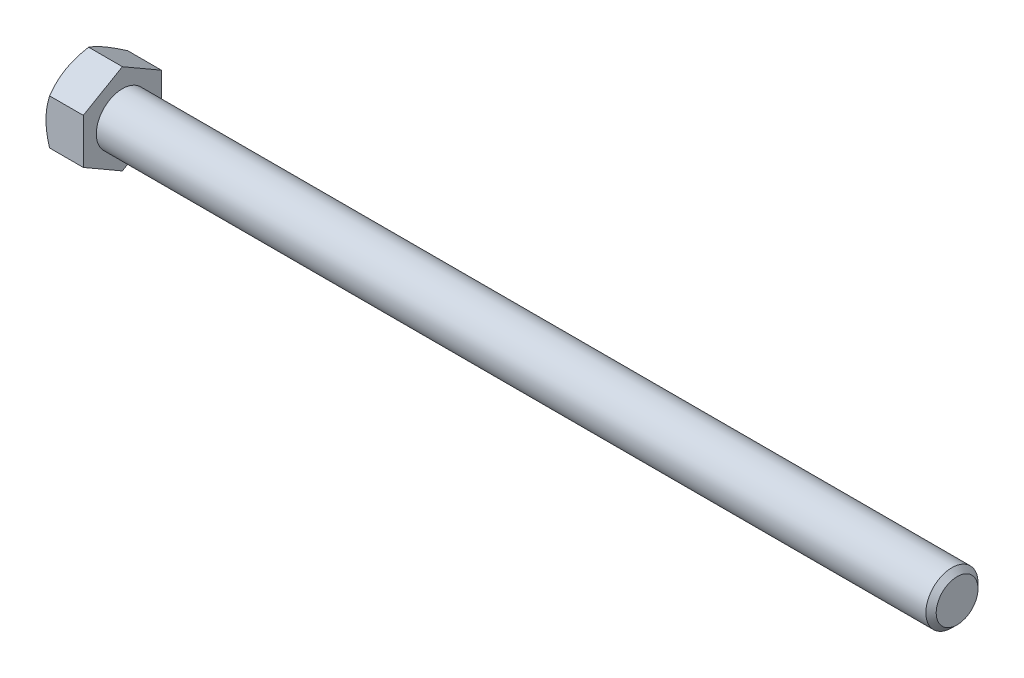
ISO-10303-21;
HEADER;
FILE_DESCRIPTION(('STEP AP214'),'2;1');
FILE_NAME('part.step','',(''),(''),'','','');
FILE_SCHEMA(('AUTOMOTIVE_DESIGN { 1 0 10303 214 1 1 1 1 }'));
ENDSEC;
DATA;
#1=APPLICATION_CONTEXT('core data for automotive mechanical design processes');
#2=APPLICATION_PROTOCOL_DEFINITION('international standard','automotive_design',2000,#1);
#3=PRODUCT_CONTEXT('',#1,'mechanical');
#4=PRODUCT('Part','Part','',(#3));
#5=PRODUCT_RELATED_PRODUCT_CATEGORY('part','',(#4));
#6=PRODUCT_DEFINITION_FORMATION('','',#4);
#7=PRODUCT_DEFINITION_CONTEXT('part definition',#1,'design');
#8=PRODUCT_DEFINITION('design','',#6,#7);
#9=PRODUCT_DEFINITION_SHAPE('','',#8);
#10=(LENGTH_UNIT() NAMED_UNIT(*) SI_UNIT(.MILLI.,.METRE.));
#11=(NAMED_UNIT(*) PLANE_ANGLE_UNIT() SI_UNIT($,.RADIAN.));
#12=(NAMED_UNIT(*) SI_UNIT($,.STERADIAN.) SOLID_ANGLE_UNIT());
#13=UNCERTAINTY_MEASURE_WITH_UNIT(LENGTH_MEASURE(1.E-05),#10,'distance_accuracy_value','');
#14=(GEOMETRIC_REPRESENTATION_CONTEXT(3) GLOBAL_UNCERTAINTY_ASSIGNED_CONTEXT((#13)) GLOBAL_UNIT_ASSIGNED_CONTEXT((#10,
#11,#12)) REPRESENTATION_CONTEXT('',''));
#15=CARTESIAN_POINT('',(0.,0.,0.));
#16=DIRECTION('',(0.,0.,1.));
#17=DIRECTION('',(1.,0.,0.));
#18=AXIS2_PLACEMENT_3D('',#15,#16,#17);
#19=CARTESIAN_POINT('',(6.8072,4.12077981131403,-7.1374));
#20=DIRECTION('',(0.,-0.866025403784438,0.500000000000001));
#21=DIRECTION('',(0.,-0.500000000000001,-0.866025403784438));
#22=AXIS2_PLACEMENT_3D('',#19,#20,#21);
#23=PLANE('',#22);
#24=CARTESIAN_POINT('',(0.637553523420349,8.24167509268191,0.000200000000000209));
#25=CARTESIAN_POINT('',(0.585265389565359,8.15109571898022,-0.15668807736911));
#26=CARTESIAN_POINT('',(0.535350289912887,8.06017862158373,-0.314161109336511));
#27=CARTESIAN_POINT('',(0.440919739394811,7.87760608276959,-0.630386022629449));
#28=CARTESIAN_POINT('',(0.396406617864104,7.78595034088604,-0.789138424377165));
#29=CARTESIAN_POINT('',(0.2718439466046,7.50951559742938,-1.26793744502137));
#30=CARTESIAN_POINT('',(0.200994122533562,7.32364541554993,-1.58987404364865));
#31=CARTESIAN_POINT('',(0.117914357261567,7.04549407114397,-2.07164630435335));
#32=CARTESIAN_POINT('',(0.0942473375753685,6.95404399131372,-2.23004248897558));
#33=CARTESIAN_POINT('',(0.0545611977075655,6.77073061920728,-2.54755056317072));
#34=CARTESIAN_POINT('',(0.0385414017966346,6.67886736416472,-2.70666238825308));
#35=CARTESIAN_POINT('',(0.0145579786669828,6.49498130931768,-3.02516237805154));
#36=CARTESIAN_POINT('',(0.00658520869042932,6.40295880983915,-3.18455002258784));
#37=CARTESIAN_POINT('',(-0.00114175893561454,6.21883388819856,-3.50346374180898));
#38=CARTESIAN_POINT('',(-0.000896210482460422,6.12673146859347,-3.66298981206503));
#39=CARTESIAN_POINT('',(0.0110730517201779,5.87440161908355,-4.10003793168242));
#40=CARTESIAN_POINT('',(0.0311658852990929,5.71425679021456,-4.37741691185292));
#41=CARTESIAN_POINT('',(0.0948800883359073,5.39503079963205,-4.93033254663834));
#42=CARTESIAN_POINT('',(0.138523234308961,5.23595076056063,-5.20586725678008));
#43=CARTESIAN_POINT('',(0.247618299095076,4.91608234409664,-5.75989560583231));
#44=CARTESIAN_POINT('',(0.313532435992711,4.75533432745402,-6.03831933787326));
#45=CARTESIAN_POINT('',(0.463130880450464,4.43623548204411,-6.59101475075978));
#46=CARTESIAN_POINT('',(0.546780048637373,4.27788056676996,-6.86529350964288));
#47=CARTESIAN_POINT('',(0.637553523420342,4.12066434126019,-7.1376));
#48=B_SPLINE_CURVE_WITH_KNOTS('',3,(#24,#25,#26,#27,#28,#29,#30,#31,#32,#33,#34,#35,#36,#37,#38,
#39,#40,#41,#42,#43,#44,#45,#46,#47),.UNSPECIFIED.,.F.,.F.,(4,2,2,2,2,2,2,2,2,2,2,4),(0.,
0.565616271543686,1.13147557690344,2.26554547664276,2.81869146049269,3.37178855781927,
3.9242565351942,4.47670744459711,5.43845614829341,6.40109569003608,7.3850851165131,
8.36714283329691),.UNSPECIFIED.);
#49=CARTESIAN_POINT('',(0.637486855352631,8.24155962262808,0.));
#50=VERTEX_POINT('',#49);
#51=CARTESIAN_POINT('',(0.,6.18116971697105,-3.56870000000001));
#52=VERTEX_POINT('',#51);
#53=EDGE_CURVE('E47',#50,#52,#48,.T.);
#54=ORIENTED_EDGE('',*,*,#53,.F.);
#55=DIRECTION('',(-1.,0.,0.));
#56=VECTOR('',#55,1.);
#57=CARTESIAN_POINT('',(6.8072,8.24155962262808,0.));
#58=LINE('',#57,#56);
#59=CARTESIAN_POINT('',(6.8072,8.24155962262808,0.));
#60=VERTEX_POINT('',#59);
#61=EDGE_CURVE('E143',#60,#50,#58,.T.);
#62=ORIENTED_EDGE('',*,*,#61,.F.);
#63=DIRECTION('',(0.,0.500000000000001,0.866025403784438));
#64=VECTOR('',#63,1.);
#65=CARTESIAN_POINT('',(6.8072,4.12077981131403,-7.1374));
#66=LINE('',#65,#64);
#67=CARTESIAN_POINT('',(6.8072,4.12077981131403,-7.1374));
#68=VERTEX_POINT('',#67);
#69=EDGE_CURVE('E228',#68,#60,#66,.T.);
#70=ORIENTED_EDGE('',*,*,#69,.F.);
#71=DIRECTION('',(-1.,0.,0.));
#72=VECTOR('',#71,1.);
#73=CARTESIAN_POINT('',(6.8072,4.12077981131403,-7.1374));
#74=LINE('',#73,#72);
#75=CARTESIAN_POINT('',(0.637486855352626,4.12077981131403,-7.1374));
#76=VERTEX_POINT('',#75);
#77=EDGE_CURVE('E131',#68,#76,#74,.T.);
#78=ORIENTED_EDGE('',*,*,#77,.T.);
#79=EDGE_CURVE('E125',#52,#76,#48,.T.);
#80=ORIENTED_EDGE('',*,*,#79,.F.);
#81=EDGE_LOOP('',(#54,#62,#70,#78,#80));
#82=FACE_BOUND('',#81,.T.);
#83=ADVANCED_FACE('F31',(#82),#23,.F.);
#84=CARTESIAN_POINT('',(6.8072,8.24155962262808,0.));
#85=DIRECTION('',(0.,-0.866025403784438,-0.500000000000001));
#86=DIRECTION('',(0.,0.500000000000001,-0.866025403784438));
#87=AXIS2_PLACEMENT_3D('',#84,#85,#86);
#88=PLANE('',#87);
#89=CARTESIAN_POINT('',(0.637553523420344,4.12066434126019,7.1376));
#90=CARTESIAN_POINT('',(0.585265389565354,4.21124371496189,6.98071192263089));
#91=CARTESIAN_POINT('',(0.535350289912882,4.30216081235838,6.82323889066349));
#92=CARTESIAN_POINT('',(0.440919739394807,4.48473335117252,6.50701397737055));
#93=CARTESIAN_POINT('',(0.3964066178641,4.57638909305606,6.34826157562283));
#94=CARTESIAN_POINT('',(0.271843946604597,4.85282383651273,5.86946255497863));
#95=CARTESIAN_POINT('',(0.20099412253356,5.03869401839218,5.54752595635135));
#96=CARTESIAN_POINT('',(0.117914357261566,5.31684536279814,5.06575369564665));
#97=CARTESIAN_POINT('',(0.094247337575367,5.40829544262839,4.90735751102442));
#98=CARTESIAN_POINT('',(0.0545611977075641,5.59160881473483,4.58984943682928));
#99=CARTESIAN_POINT('',(0.0385414017966333,5.68347206977738,4.43073761174692));
#100=CARTESIAN_POINT('',(0.0145579786669821,5.86735812462442,4.11223762194846));
#101=CARTESIAN_POINT('',(0.00658520869042904,5.95938062410295,3.95284997741216));
#102=CARTESIAN_POINT('',(-0.00114175893561427,6.14350554574354,3.63393625819102));
#103=CARTESIAN_POINT('',(-0.000896210482460006,6.23560796534864,3.47441018793497));
#104=CARTESIAN_POINT('',(0.0110730517201789,6.48793781485856,3.03736206831758));
#105=CARTESIAN_POINT('',(0.0311658852990944,6.64808264372754,2.75998308814708));
#106=CARTESIAN_POINT('',(0.0948800883359096,6.96730863431005,2.20706745336167));
#107=CARTESIAN_POINT('',(0.138523234308963,7.12638867338148,1.93153274321992));
#108=CARTESIAN_POINT('',(0.24761829909508,7.44625708984546,1.37750439416769));
#109=CARTESIAN_POINT('',(0.313532435992716,7.60700510648809,1.09908066212674));
#110=CARTESIAN_POINT('',(0.463130880450469,7.926103951898,0.546385249240216));
#111=CARTESIAN_POINT('',(0.546780048637379,8.08445886717215,0.272106490357122));
#112=CARTESIAN_POINT('',(0.637553523420349,8.24167509268191,-0.000199999999999955));
#113=B_SPLINE_CURVE_WITH_KNOTS('',3,(#89,#90,#91,#92,#93,#94,#95,#96,#97,#98,#99,#100,#101,#102,
#103,#104,#105,#106,#107,#108,#109,#110,#111,#112),.UNSPECIFIED.,.F.,.F.,(4,2,2,2,2,2,2,2,2,2,2,
4),(0.,0.565616271543686,1.13147557690344,2.26554547664276,2.81869146049269,3.37178855781927,
3.92425653519419,4.4767074445971,5.4384561482934,6.40109569003607,7.3850851165131,
8.36714283329691),.UNSPECIFIED.);
#114=CARTESIAN_POINT('',(0.637486855352626,4.12077981131403,7.1374));
#115=VERTEX_POINT('',#114);
#116=CARTESIAN_POINT('',(0.,6.18116971697105,3.56870000000001));
#117=VERTEX_POINT('',#116);
#118=EDGE_CURVE('E54',#115,#117,#113,.T.);
#119=ORIENTED_EDGE('',*,*,#118,.F.);
#120=DIRECTION('',(-1.,0.,0.));
#121=VECTOR('',#120,1.);
#122=CARTESIAN_POINT('',(6.8072,4.12077981131403,7.1374));
#123=LINE('',#122,#121);
#124=CARTESIAN_POINT('',(6.8072,4.12077981131403,7.1374));
#125=VERTEX_POINT('',#124);
#126=EDGE_CURVE('E141',#125,#115,#123,.T.);
#127=ORIENTED_EDGE('',*,*,#126,.F.);
#128=DIRECTION('',(0.,-0.500000000000001,0.866025403784438));
#129=VECTOR('',#128,1.);
#130=CARTESIAN_POINT('',(6.8072,8.24155962262808,0.));
#131=LINE('',#130,#129);
#132=EDGE_CURVE('E226',#60,#125,#131,.T.);
#133=ORIENTED_EDGE('',*,*,#132,.F.);
#134=ORIENTED_EDGE('',*,*,#61,.T.);
#135=EDGE_CURVE('E158',#117,#50,#113,.T.);
#136=ORIENTED_EDGE('',*,*,#135,.F.);
#137=EDGE_LOOP('',(#119,#127,#133,#134,#136));
#138=FACE_BOUND('',#137,.T.);
#139=ADVANCED_FACE('F164',(#138),#88,.F.);
#140=CARTESIAN_POINT('',(6.8072,4.12077981131403,7.1374));
#141=DIRECTION('',(0.,0.,-1.));
#142=DIRECTION('',(-1.,0.,0.));
#143=AXIS2_PLACEMENT_3D('',#140,#141,#142);
#144=PLANE('',#143);
#145=CARTESIAN_POINT('',(3.51793891464087,-11.1403587268437,7.1374));
#146=CARTESIAN_POINT('',(3.36611761361542,-10.8279722926893,7.1374));
#147=CARTESIAN_POINT('',(3.21573167435817,-10.5148763007017,7.1374));
#148=CARTESIAN_POINT('',(2.91863653133452,-9.88688803265219,7.1374));
#149=CARTESIAN_POINT('',(2.77192789362364,-9.57199548909054,7.1374));
#150=CARTESIAN_POINT('',(2.48227074397641,-8.93844907707202,7.1374));
#151=CARTESIAN_POINT('',(2.33934643030355,-8.6197841073444,7.1374));
#152=CARTESIAN_POINT('',(2.05925336317275,-7.97994405772779,7.1374));
#153=CARTESIAN_POINT('',(1.92208434228597,-7.65876909529408,7.1374));
#154=CARTESIAN_POINT('',(1.65065378230837,-7.00284865103084,7.1374));
#155=CARTESIAN_POINT('',(1.51663374065787,-6.66800268560584,7.1374));
#156=CARTESIAN_POINT('',(1.25856485288051,-5.99442084818064,7.1374));
#157=CARTESIAN_POINT('',(1.13451711533335,-5.6556845484785,7.1374));
#158=CARTESIAN_POINT('',(0.899596727677591,-4.97438980758155,7.1374));
#159=CARTESIAN_POINT('',(0.788698036742919,-4.63184044199148,7.1374));
#160=CARTESIAN_POINT('',(0.583585288609214,-3.94184101121261,7.1374));
#161=CARTESIAN_POINT('',(0.489366053461915,-3.5943925031972,7.1374));
#162=CARTESIAN_POINT('',(0.322585119775289,-2.89623643412328,7.1374));
#163=CARTESIAN_POINT('',(0.249906108267923,-2.54555766855628,7.1374));
#164=CARTESIAN_POINT('',(0.160162927876226,-2.01629019056174,7.1374));
#165=CARTESIAN_POINT('',(0.133459926561135,-1.83931395899738,7.1374));
#166=CARTESIAN_POINT('',(0.0870009608751857,-1.48445773938035,7.1374));
#167=CARTESIAN_POINT('',(0.0672443235865571,-1.3065778405635,7.1374));
#168=CARTESIAN_POINT('',(0.0353233928817902,-0.952509042934668,7.1374));
#169=CARTESIAN_POINT('',(0.0230620606560359,-0.776328928434239,7.1374));
#170=CARTESIAN_POINT('',(0.00600431660240757,-0.423607840789667,7.1374));
#171=CARTESIAN_POINT('',(0.00120777872271188,-0.247066873789351,7.1374));
#172=CARTESIAN_POINT('',(-0.000805707966080775,0.106061109313546,7.1374));
#173=CARTESIAN_POINT('',(0.00197740745485913,0.28264812579367,7.1374));
#174=CARTESIAN_POINT('',(0.0150543642253251,0.63554598012671,7.1374));
#175=CARTESIAN_POINT('',(0.0253485677088158,0.811856804252743,7.1374));
#176=CARTESIAN_POINT('',(0.0587173546676627,1.23335791869126,7.1374));
#177=CARTESIAN_POINT('',(0.0852317102922993,1.47828183508495,7.1374));
#178=CARTESIAN_POINT('',(0.151325348901079,1.96634766484074,7.1374));
#179=CARTESIAN_POINT('',(0.190906342916658,2.20948934056,7.1374));
#180=CARTESIAN_POINT('',(0.327153349211708,2.93593608611635,7.1374));
#181=CARTESIAN_POINT('',(0.441300495017734,3.41600789467397,7.1374));
#182=CARTESIAN_POINT('',(0.639740105584515,4.13409780337111,7.1374));
#183=CARTESIAN_POINT('',(0.711386839279741,4.37582477933243,7.1374));
#184=CARTESIAN_POINT('',(0.862240726867139,4.85693123459409,7.1374));
#185=CARTESIAN_POINT('',(0.941447936163008,5.0963106966775,7.1374));
#186=CARTESIAN_POINT('',(1.10614180608764,5.57279746249284,7.1374));
#187=CARTESIAN_POINT('',(1.19162653724197,5.80990543927401,7.1374));
#188=CARTESIAN_POINT('',(1.36785754588297,6.28214651090288,7.1374));
#189=CARTESIAN_POINT('',(1.45860372166631,6.51727964382366,7.1374));
#190=CARTESIAN_POINT('',(1.70099135878087,7.12822933634873,7.1374));
#191=CARTESIAN_POINT('',(1.85611245200932,7.50266378649049,7.1374));
#192=CARTESIAN_POINT('',(2.17492034788948,8.24788094227113,7.1374));
#193=CARTESIAN_POINT('',(2.33860795452501,8.61866330125999,7.1374));
#194=CARTESIAN_POINT('',(2.67260301704527,9.35737269718076,7.1374));
#195=CARTESIAN_POINT('',(2.84291264405931,9.72529874938111,7.1374));
#196=CARTESIAN_POINT('',(3.18863367809309,10.4587232704181,7.1374));
#197=CARTESIAN_POINT('',(3.36404491157502,10.8242218213112,7.1374));
#198=CARTESIAN_POINT('',(3.71915496627051,11.553777334436,7.1374));
#199=CARTESIAN_POINT('',(3.89885959822868,11.9178314626509,7.1374));
#200=CARTESIAN_POINT('',(4.26150568432079,12.6443245246618,7.1374));
#201=CARTESIAN_POINT('',(4.44444716083245,13.0067634472695,7.1374));
#202=CARTESIAN_POINT('',(4.81291716764718,13.7302353242129,7.1374));
#203=CARTESIAN_POINT('',(4.99844519827986,14.0912685333268,7.1374));
#204=CARTESIAN_POINT('',(5.37165471040539,14.8122208146436,7.1374));
#205=CARTESIAN_POINT('',(5.55933620037513,15.1721398824536,7.1374));
#206=CARTESIAN_POINT('',(6.08751400276292,16.1789579520409,7.1374));
#207=CARTESIAN_POINT('',(6.43000254365915,16.8248116492746,7.1374));
#208=CARTESIAN_POINT('',(7.11919785487999,18.1143032770824,7.1374));
#209=CARTESIAN_POINT('',(7.46590484738288,18.7579410886394,7.1374));
#210=CARTESIAN_POINT('',(8.16140637459832,20.0415314633598,7.1374));
#211=CARTESIAN_POINT('',(8.51019123426675,20.6814892741017,7.1374));
#212=CARTESIAN_POINT('',(9.21019417047445,21.9600146152104,7.1374));
#213=CARTESIAN_POINT('',(9.56141207357471,22.598582240497,7.1374));
#214=CARTESIAN_POINT('',(9.9135191344137,23.2366555668876,7.1374));
#215=B_SPLINE_CURVE_WITH_KNOTS('',3,(#145,#146,#147,#148,#149,#150,#151,#152,#153,#154,#155,
#156,#157,#158,#159,#160,#161,#162,#163,#164,#165,#166,#167,#168,#169,#170,#171,#172,#173,#174,
#175,#176,#177,#178,#179,#180,#181,#182,#183,#184,#185,#186,#187,#188,#189,#190,#191,#192,#193,
#194,#195,#196,#197,#198,#199,#200,#201,#202,#203,#204,#205,#206,#207,#208,#209,#210,#211,#212,
#213,#214),.UNSPECIFIED.,.F.,.F.,(4,2,2,2,2,2,2,2,2,2,2,2,2,2,2,2,2,2,2,2,2,2,2,2,2,2,2,2,2,2,2,
2,2,2,4),(0.,1.0419888362068,2.08413709519682,3.13183784368231,4.17948985504911,
5.26137797247102,6.34338619307611,7.42321444996099,8.50270689628367,9.57620733057732,
10.113030795566,10.6498022423129,11.179468394122,11.7091256017988,12.2387872978086,
12.7684745322176,13.5071235743819,14.245869378494,15.7241255438818,16.4804246089875,
17.2367292167316,17.9928023300467,18.7488608333938,19.9645892594812,21.1804319893616,
22.3966767697582,23.6128802262777,24.8308351286452,26.0487984545625,27.2665296678531,
28.4842656762731,30.6773737382256,32.8705978115956,35.0570894097064,37.2434267159856),.UNSPECIFIED.);
#216=CARTESIAN_POINT('',(0.637486855352625,-4.12077981131402,7.1374));
#217=VERTEX_POINT('',#216);
#218=CARTESIAN_POINT('',(0.,0.,7.1374));
#219=VERTEX_POINT('',#218);
#220=EDGE_CURVE('E238',#217,#219,#215,.T.);
#221=ORIENTED_EDGE('',*,*,#220,.F.);
#222=DIRECTION('',(-1.,0.,0.));
#223=VECTOR('',#222,1.);
#224=CARTESIAN_POINT('',(6.8072,-4.12077981131402,7.1374));
#225=LINE('',#224,#223);
#226=CARTESIAN_POINT('',(6.8072,-4.12077981131402,7.1374));
#227=VERTEX_POINT('',#226);
#228=EDGE_CURVE('E133',#227,#217,#225,.T.);
#229=ORIENTED_EDGE('',*,*,#228,.F.);
#230=DIRECTION('',(0.,-1.,0.));
#231=VECTOR('',#230,1.);
#232=CARTESIAN_POINT('',(6.8072,4.12077981131403,7.1374));
#233=LINE('',#232,#231);
#234=EDGE_CURVE('E222',#125,#227,#233,.T.);
#235=ORIENTED_EDGE('',*,*,#234,.F.);
#236=ORIENTED_EDGE('',*,*,#126,.T.);
#237=EDGE_CURVE('E180',#219,#115,#215,.T.);
#238=ORIENTED_EDGE('',*,*,#237,.F.);
#239=EDGE_LOOP('',(#221,#229,#235,#236,#238));
#240=FACE_BOUND('',#239,.T.);
#241=ADVANCED_FACE('F244',(#240),#144,.F.);
#242=CARTESIAN_POINT('',(6.8072,-8.24155962262808,0.));
#243=DIRECTION('',(0.,0.866025403784438,-0.500000000000002));
#244=DIRECTION('',(0.,0.500000000000002,0.866025403784438));
#245=AXIS2_PLACEMENT_3D('',#242,#243,#244);
#246=PLANE('',#245);
#247=CARTESIAN_POINT('',(0.637553523420351,-8.24167509268192,-0.000200000000000067));
#248=CARTESIAN_POINT('',(0.585265389565361,-8.15109571898022,0.15668807736911));
#249=CARTESIAN_POINT('',(0.535350289912889,-8.06017862158373,0.314161109336512));
#250=CARTESIAN_POINT('',(0.440919739394813,-7.87760608276959,0.63038602262945));
#251=CARTESIAN_POINT('',(0.396406617864105,-7.78595034088604,0.789138424377165));
#252=CARTESIAN_POINT('',(0.271843946604601,-7.50951559742938,1.26793744502137));
#253=CARTESIAN_POINT('',(0.200994122533563,-7.32364541554993,1.58987404364865));
#254=CARTESIAN_POINT('',(0.117914357261568,-7.04549407114397,2.07164630435335));
#255=CARTESIAN_POINT('',(0.0942473375753691,-6.95404399131372,2.23004248897558));
#256=CARTESIAN_POINT('',(0.0545611977075657,-6.77073061920728,2.54755056317072));
#257=CARTESIAN_POINT('',(0.0385414017966347,-6.67886736416472,2.70666238825308));
#258=CARTESIAN_POINT('',(0.0145579786669826,-6.49498130931768,3.02516237805154));
#259=CARTESIAN_POINT('',(0.00658520869042883,-6.40295880983915,3.18455002258784));
#260=CARTESIAN_POINT('',(-0.0011417589356153,-6.21883388819856,3.50346374180898));
#261=CARTESIAN_POINT('',(-0.000896210482461203,-6.12673146859347,3.66298981206503));
#262=CARTESIAN_POINT('',(0.0110730517201772,-5.87440161908354,4.10003793168242));
#263=CARTESIAN_POINT('',(0.0311658852990923,-5.71425679021456,4.37741691185292));
#264=CARTESIAN_POINT('',(0.0948800883359067,-5.39503079963205,4.93033254663834));
#265=CARTESIAN_POINT('',(0.13852323430896,-5.23595076056062,5.20586725678008));
#266=CARTESIAN_POINT('',(0.247618299095075,-4.91608234409664,5.75989560583231));
#267=CARTESIAN_POINT('',(0.31353243599271,-4.75533432745402,6.03831933787326));
#268=CARTESIAN_POINT('',(0.463130880450462,-4.4362354820441,6.59101475075978));
#269=CARTESIAN_POINT('',(0.546780048637372,-4.27788056676995,6.86529350964288));
#270=CARTESIAN_POINT('',(0.637553523420342,-4.12066434126019,7.1376));
#271=B_SPLINE_CURVE_WITH_KNOTS('',3,(#247,#248,#249,#250,#251,#252,#253,#254,#255,#256,#257,
#258,#259,#260,#261,#262,#263,#264,#265,#266,#267,#268,#269,#270),.UNSPECIFIED.,.F.,.F.,(4,2,2,
2,2,2,2,2,2,2,2,4),(0.,0.565616271543688,1.13147557690344,2.26554547664277,2.81869146049269,
3.37178855781927,3.9242565351942,4.47670744459711,5.43845614829341,6.40109569003608,
7.38508511651311,8.36714283329692),.UNSPECIFIED.);
#272=CARTESIAN_POINT('',(0.637486855352633,-8.24155962262808,0.));
#273=VERTEX_POINT('',#272);
#274=CARTESIAN_POINT('',(0.,-6.18116971697104,3.56870000000001));
#275=VERTEX_POINT('',#274);
#276=EDGE_CURVE('E166',#273,#275,#271,.T.);
#277=ORIENTED_EDGE('',*,*,#276,.F.);
#278=DIRECTION('',(-1.,0.,0.));
#279=VECTOR('',#278,1.);
#280=CARTESIAN_POINT('',(6.8072,-8.24155962262808,0.));
#281=LINE('',#280,#279);
#282=CARTESIAN_POINT('',(6.8072,-8.24155962262808,0.));
#283=VERTEX_POINT('',#282);
#284=EDGE_CURVE('E130',#283,#273,#281,.T.);
#285=ORIENTED_EDGE('',*,*,#284,.F.);
#286=DIRECTION('',(0.,-0.500000000000002,-0.866025403784438));
#287=VECTOR('',#286,1.);
#288=CARTESIAN_POINT('',(6.8072,-8.24155962262808,0.));
#289=LINE('',#288,#287);
#290=EDGE_CURVE('E220',#227,#283,#289,.T.);
#291=ORIENTED_EDGE('',*,*,#290,.F.);
#292=ORIENTED_EDGE('',*,*,#228,.T.);
#293=EDGE_CURVE('E168',#275,#217,#271,.T.);
#294=ORIENTED_EDGE('',*,*,#293,.F.);
#295=EDGE_LOOP('',(#277,#285,#291,#292,#294));
#296=FACE_BOUND('',#295,.T.);
#297=ADVANCED_FACE('F216',(#296),#246,.F.);
#298=CARTESIAN_POINT('',(6.8072,-4.12077981131404,-7.1374));
#299=DIRECTION('',(0.,0.866025403784439,0.5));
#300=DIRECTION('',(0.,-0.5,0.866025403784439));
#301=AXIS2_PLACEMENT_3D('',#298,#299,#300);
#302=PLANE('',#301);
#303=CARTESIAN_POINT('',(0.637553523420347,-4.1206643412602,-7.1376));
#304=CARTESIAN_POINT('',(0.585265389565357,-4.2112437149619,-6.98071192263089));
#305=CARTESIAN_POINT('',(0.535350289912885,-4.30216081235839,-6.82323889066349));
#306=CARTESIAN_POINT('',(0.44091973939481,-4.48473335117253,-6.50701397737055));
#307=CARTESIAN_POINT('',(0.396406617864103,-4.57638909305608,-6.34826157562283));
#308=CARTESIAN_POINT('',(0.2718439466046,-4.85282383651274,-5.86946255497863));
#309=CARTESIAN_POINT('',(0.200994122533563,-5.03869401839219,-5.54752595635135));
#310=CARTESIAN_POINT('',(0.117914357261569,-5.31684536279815,-5.06575369564664));
#311=CARTESIAN_POINT('',(0.0942473375753701,-5.4082954426284,-4.90735751102441));
#312=CARTESIAN_POINT('',(0.0545611977075675,-5.59160881473484,-4.58984943682928));
#313=CARTESIAN_POINT('',(0.0385414017966369,-5.68347206977739,-4.43073761174692));
#314=CARTESIAN_POINT('',(0.0145579786669858,-5.86735812462443,-4.11223762194845));
#315=CARTESIAN_POINT('',(0.00658520869043265,-5.95938062410296,-3.95284997741216));
#316=CARTESIAN_POINT('',(-0.00114175893561087,-6.14350554574355,-3.63393625819102));
#317=CARTESIAN_POINT('',(-0.000896210482456751,-6.23560796534865,-3.47441018793497));
#318=CARTESIAN_POINT('',(0.0110730517201821,-6.48793781485857,-3.03736206831757));
#319=CARTESIAN_POINT('',(0.0311658852990979,-6.64808264372755,-2.75998308814708));
#320=CARTESIAN_POINT('',(0.0948800883359132,-6.96730863431006,-2.20706745336166));
#321=CARTESIAN_POINT('',(0.138523234308966,-7.12638867338148,-1.93153274321991));
#322=CARTESIAN_POINT('',(0.247618299095082,-7.44625708984547,-1.37750439416769));
#323=CARTESIAN_POINT('',(0.313532435992718,-7.60700510648809,-1.09908066212674));
#324=CARTESIAN_POINT('',(0.463130880450472,-7.926103951898,-0.546385249240216));
#325=CARTESIAN_POINT('',(0.546780048637381,-8.08445886717215,-0.272106490357122));
#326=CARTESIAN_POINT('',(0.637553523420351,-8.24167509268192,0.000200000000000159));
#327=B_SPLINE_CURVE_WITH_KNOTS('',3,(#303,#304,#305,#306,#307,#308,#309,#310,#311,#312,#313,
#314,#315,#316,#317,#318,#319,#320,#321,#322,#323,#324,#325,#326),.UNSPECIFIED.,.F.,.F.,(4,2,2,
2,2,2,2,2,2,2,2,4),(0.,0.565616271543688,1.13147557690344,2.26554547664276,2.81869146049269,
3.37178855781927,3.9242565351942,4.4767074445971,5.4384561482934,6.40109569003607,
7.3850851165131,8.3671428332969),.UNSPECIFIED.);
#328=CARTESIAN_POINT('',(0.637486855352629,-4.12077981131404,-7.1374));
#329=VERTEX_POINT('',#328);
#330=CARTESIAN_POINT('',(0.,-6.18116971697105,-3.5687));
#331=VERTEX_POINT('',#330);
#332=EDGE_CURVE('E107',#329,#331,#327,.T.);
#333=ORIENTED_EDGE('',*,*,#332,.F.);
#334=DIRECTION('',(-1.,0.,0.));
#335=VECTOR('',#334,1.);
#336=CARTESIAN_POINT('',(6.8072,-4.12077981131404,-7.1374));
#337=LINE('',#336,#335);
#338=CARTESIAN_POINT('',(6.8072,-4.12077981131404,-7.1374));
#339=VERTEX_POINT('',#338);
#340=EDGE_CURVE('E121',#339,#329,#337,.T.);
#341=ORIENTED_EDGE('',*,*,#340,.F.);
#342=DIRECTION('',(0.,0.5,-0.866025403784438));
#343=VECTOR('',#342,1.);
#344=CARTESIAN_POINT('',(6.8072,-4.12077981131404,-7.1374));
#345=LINE('',#344,#343);
#346=EDGE_CURVE('E218',#283,#339,#345,.T.);
#347=ORIENTED_EDGE('',*,*,#346,.F.);
#348=ORIENTED_EDGE('',*,*,#284,.T.);
#349=EDGE_CURVE('E124',#331,#273,#327,.T.);
#350=ORIENTED_EDGE('',*,*,#349,.F.);
#351=EDGE_LOOP('',(#333,#341,#347,#348,#350));
#352=FACE_BOUND('',#351,.T.);
#353=ADVANCED_FACE('F119',(#352),#302,.F.);
#354=CARTESIAN_POINT('',(6.8072,4.12077981131403,-7.1374));
#355=DIRECTION('',(0.,0.,1.));
#356=DIRECTION('',(1.,0.,0.));
#357=AXIS2_PLACEMENT_3D('',#354,#355,#356);
#358=PLANE('',#357);
#359=CARTESIAN_POINT('',(3.51793891464088,-11.1403587268438,-7.1374));
#360=CARTESIAN_POINT('',(3.36611761361543,-10.8279722926893,-7.1374));
#361=CARTESIAN_POINT('',(3.21573167435817,-10.5148763007017,-7.1374));
#362=CARTESIAN_POINT('',(2.91863653133452,-9.88688803265221,-7.1374));
#363=CARTESIAN_POINT('',(2.77192789362365,-9.57199548909056,-7.1374));
#364=CARTESIAN_POINT('',(2.48227074397642,-8.93844907707204,-7.1374));
#365=CARTESIAN_POINT('',(2.33934643030356,-8.61978410734442,-7.1374));
#366=CARTESIAN_POINT('',(2.05925336317276,-7.97994405772781,-7.1374));
#367=CARTESIAN_POINT('',(1.92208434228598,-7.6587690952941,-7.1374));
#368=CARTESIAN_POINT('',(1.65065378230838,-7.00284865103086,-7.1374));
#369=CARTESIAN_POINT('',(1.51663374065788,-6.66800268560586,-7.1374));
#370=CARTESIAN_POINT('',(1.25856485288051,-5.99442084818067,-7.1374));
#371=CARTESIAN_POINT('',(1.13451711533335,-5.65568454847852,-7.1374));
#372=CARTESIAN_POINT('',(0.899596727677598,-4.97438980758156,-7.1374));
#373=CARTESIAN_POINT('',(0.788698036742925,-4.6318404419915,-7.1374));
#374=CARTESIAN_POINT('',(0.583585288609219,-3.94184101121262,-7.1374));
#375=CARTESIAN_POINT('',(0.489366053461918,-3.59439250319721,-7.1374));
#376=CARTESIAN_POINT('',(0.322585119775292,-2.8962364341233,-7.1374));
#377=CARTESIAN_POINT('',(0.249906108267925,-2.54555766855629,-7.1374));
#378=CARTESIAN_POINT('',(0.160162927876228,-2.01629019056176,-7.1374));
#379=CARTESIAN_POINT('',(0.133459926561137,-1.8393139589974,-7.1374));
#380=CARTESIAN_POINT('',(0.0870009608751871,-1.48445773938036,-7.1374));
#381=CARTESIAN_POINT('',(0.0672443235865583,-1.30657784056351,-7.1374));
#382=CARTESIAN_POINT('',(0.035323392881791,-0.952509042934683,-7.1374));
#383=CARTESIAN_POINT('',(0.0230620606560367,-0.776328928434253,-7.1374));
#384=CARTESIAN_POINT('',(0.00600431660240784,-0.423607840789681,-7.1374));
#385=CARTESIAN_POINT('',(0.00120777872271167,-0.247066873789365,-7.1374));
#386=CARTESIAN_POINT('',(-0.000805707966081563,0.106061109313532,-7.1374));
#387=CARTESIAN_POINT('',(0.00197740745485825,0.282648125793656,-7.1374));
#388=CARTESIAN_POINT('',(0.0150543642253239,0.635545980126696,-7.1374));
#389=CARTESIAN_POINT('',(0.0253485677088145,0.811856804252729,-7.1374));
#390=CARTESIAN_POINT('',(0.058717354667661,1.23335791869125,-7.1374));
#391=CARTESIAN_POINT('',(0.0852317102922972,1.47828183508493,-7.1374));
#392=CARTESIAN_POINT('',(0.151325348901076,1.96634766484072,-7.1374));
#393=CARTESIAN_POINT('',(0.190906342916654,2.20948934055999,-7.1374));
#394=CARTESIAN_POINT('',(0.327153349211703,2.93593608611633,-7.1374));
#395=CARTESIAN_POINT('',(0.441300495017729,3.41600789467395,-7.1374));
#396=CARTESIAN_POINT('',(0.639740105584508,4.13409780337109,-7.1374));
#397=CARTESIAN_POINT('',(0.711386839279735,4.37582477933241,-7.1374));
#398=CARTESIAN_POINT('',(0.862240726867133,4.85693123459407,-7.1374));
#399=CARTESIAN_POINT('',(0.941447936163001,5.09631069667747,-7.1374));
#400=CARTESIAN_POINT('',(1.10614180608763,5.57279746249282,-7.1374));
#401=CARTESIAN_POINT('',(1.19162653724196,5.80990543927398,-7.1374));
#402=CARTESIAN_POINT('',(1.36785754588296,6.28214651090285,-7.1374));
#403=CARTESIAN_POINT('',(1.4586037216663,6.51727964382363,-7.1374));
#404=CARTESIAN_POINT('',(1.70099135878086,7.1282293363487,-7.1374));
#405=CARTESIAN_POINT('',(1.85611245200931,7.50266378649047,-7.1374));
#406=CARTESIAN_POINT('',(2.17492034788947,8.24788094227111,-7.1374));
#407=CARTESIAN_POINT('',(2.338607954525,8.61866330125997,-7.1374));
#408=CARTESIAN_POINT('',(2.67260301704526,9.35737269718074,-7.1374));
#409=CARTESIAN_POINT('',(2.8429126440593,9.72529874938109,-7.1374));
#410=CARTESIAN_POINT('',(3.18863367809308,10.4587232704181,-7.1374));
#411=CARTESIAN_POINT('',(3.36404491157501,10.8242218213111,-7.1374));
#412=CARTESIAN_POINT('',(3.7191549662705,11.553777334436,-7.1374));
#413=CARTESIAN_POINT('',(3.89885959822867,11.9178314626509,-7.1374));
#414=CARTESIAN_POINT('',(4.26150568432078,12.6443245246618,-7.1374));
#415=CARTESIAN_POINT('',(4.44444716083244,13.0067634472695,-7.1374));
#416=CARTESIAN_POINT('',(4.81291716764717,13.7302353242129,-7.1374));
#417=CARTESIAN_POINT('',(4.99844519827985,14.0912685333268,-7.1374));
#418=CARTESIAN_POINT('',(5.37165471040538,14.8122208146436,-7.1374));
#419=CARTESIAN_POINT('',(5.55933620037512,15.1721398824536,-7.1374));
#420=CARTESIAN_POINT('',(6.08751400276291,16.1789579520409,-7.1374));
#421=CARTESIAN_POINT('',(6.43000254365915,16.8248116492745,-7.1374));
#422=CARTESIAN_POINT('',(7.11919785487999,18.1143032770824,-7.1374));
#423=CARTESIAN_POINT('',(7.46590484738288,18.7579410886393,-7.1374));
#424=CARTESIAN_POINT('',(8.16140637459832,20.0415314633598,-7.1374));
#425=CARTESIAN_POINT('',(8.51019123426675,20.6814892741017,-7.1374));
#426=CARTESIAN_POINT('',(9.21019417047446,21.9600146152104,-7.1374));
#427=CARTESIAN_POINT('',(9.56141207357471,22.598582240497,-7.1374));
#428=CARTESIAN_POINT('',(9.9135191344137,23.2366555668876,-7.1374));
#429=B_SPLINE_CURVE_WITH_KNOTS('',3,(#359,#360,#361,#362,#363,#364,#365,#366,#367,#368,#369,
#370,#371,#372,#373,#374,#375,#376,#377,#378,#379,#380,#381,#382,#383,#384,#385,#386,#387,#388,
#389,#390,#391,#392,#393,#394,#395,#396,#397,#398,#399,#400,#401,#402,#403,#404,#405,#406,#407,
#408,#409,#410,#411,#412,#413,#414,#415,#416,#417,#418,#419,#420,#421,#422,#423,#424,#425,#426,
#427,#428),.UNSPECIFIED.,.F.,.F.,(4,2,2,2,2,2,2,2,2,2,2,2,2,2,2,2,2,2,2,2,2,2,2,2,2,2,2,2,2,2,2,
2,2,2,4),(0.,1.0419888362068,2.08413709519682,3.13183784368231,4.17948985504911,
5.26137797247103,6.34338619307611,7.42321444996099,8.50270689628368,9.57620733057733,
10.113030795566,10.6498022423129,11.179468394122,11.7091256017988,12.2387872978086,
12.7684745322176,13.507123574382,14.245869378494,15.7241255438818,16.4804246089875,
17.2367292167316,17.9928023300467,18.7488608333938,19.9645892594812,21.1804319893616,
22.3966767697582,23.6128802262777,24.8308351286452,26.0487984545625,27.2665296678531,
28.4842656762731,30.6773737382256,32.8705978115956,35.0570894097065,37.2434267159856),.UNSPECIFIED.);
#430=CARTESIAN_POINT('',(0.,0.,-7.1374));
#431=VERTEX_POINT('',#430);
#432=EDGE_CURVE('E113',#76,#431,#429,.F.);
#433=ORIENTED_EDGE('',*,*,#432,.F.);
#434=ORIENTED_EDGE('',*,*,#77,.F.);
#435=DIRECTION('',(0.,1.,0.));
#436=VECTOR('',#435,1.);
#437=CARTESIAN_POINT('',(6.8072,4.12077981131403,-7.1374));
#438=LINE('',#437,#436);
#439=EDGE_CURVE('E129',#339,#68,#438,.T.);
#440=ORIENTED_EDGE('',*,*,#439,.F.);
#441=ORIENTED_EDGE('',*,*,#340,.T.);
#442=EDGE_CURVE('E104',#431,#329,#429,.F.);
#443=ORIENTED_EDGE('',*,*,#442,.F.);
#444=EDGE_LOOP('',(#433,#434,#440,#441,#443));
#445=FACE_BOUND('',#444,.T.);
#446=ADVANCED_FACE('F127',(#445),#358,.F.);
#447=CARTESIAN_POINT('',(6.8072,8.24155962262808,0.));
#448=DIRECTION('',(1.,0.,0.));
#449=DIRECTION('',(0.,0.,-1.));
#450=AXIS2_PLACEMENT_3D('',#447,#448,#449);
#451=PLANE('',#450);
#452=ORIENTED_EDGE('',*,*,#69,.T.);
#453=ORIENTED_EDGE('',*,*,#132,.T.);
#454=ORIENTED_EDGE('',*,*,#234,.T.);
#455=ORIENTED_EDGE('',*,*,#290,.T.);
#456=ORIENTED_EDGE('',*,*,#346,.T.);
#457=ORIENTED_EDGE('',*,*,#439,.T.);
#458=EDGE_LOOP('',(#452,#453,#454,#455,#456,#457));
#459=FACE_BOUND('',#458,.T.);
#460=CARTESIAN_POINT('',(6.8072,0.,0.));
#461=DIRECTION('',(1.,0.,0.));
#462=DIRECTION('',(0.,0.,-1.));
#463=AXIS2_PLACEMENT_3D('',#460,#461,#462);
#464=CIRCLE('',#463,4.7625);
#465=CARTESIAN_POINT('',(6.8072,0.,-4.7625));
#466=VERTEX_POINT('',#465);
#467=EDGE_CURVE('E231',#466,#466,#464,.F.);
#468=ORIENTED_EDGE('',*,*,#467,.T.);
#469=EDGE_LOOP('',(#468));
#470=FACE_BOUND('',#469,.T.);
#471=ADVANCED_FACE('F246',(#459,#470),#451,.T.);
#472=CARTESIAN_POINT('',(0.,0.,0.));
#473=DIRECTION('',(-1.,0.,0.));
#474=DIRECTION('',(0.,0.,1.));
#475=AXIS2_PLACEMENT_3D('',#472,#473,#474);
#476=CYLINDRICAL_SURFACE('',#475,4.7625);
#477=ORIENTED_EDGE('',*,*,#467,.F.);
#478=EDGE_LOOP('',(#477));
#479=FACE_BOUND('',#478,.T.);
#480=CARTESIAN_POINT('',(158.26105,0.,0.));
#481=DIRECTION('',(-1.,0.,0.));
#482=DIRECTION('',(0.,0.,1.));
#483=AXIS2_PLACEMENT_3D('',#480,#481,#482);
#484=CIRCLE('',#483,4.7625);
#485=CARTESIAN_POINT('',(158.26105,0.,4.7625));
#486=VERTEX_POINT('',#485);
#487=EDGE_CURVE('E234',#486,#486,#484,.T.);
#488=ORIENTED_EDGE('',*,*,#487,.T.);
#489=EDGE_LOOP('',(#488));
#490=FACE_BOUND('',#489,.T.);
#491=ADVANCED_FACE('F278',(#479,#490),#476,.T.);
#492=CARTESIAN_POINT('',(159.2072,0.,0.));
#493=DIRECTION('',(-1.,0.,0.));
#494=DIRECTION('',(0.,0.,1.));
#495=AXIS2_PLACEMENT_3D('',#492,#493,#494);
#496=CONICAL_SURFACE('',#495,3.81635,0.785398163397459);
#497=ORIENTED_EDGE('',*,*,#487,.F.);
#498=EDGE_LOOP('',(#497));
#499=FACE_BOUND('',#498,.T.);
#500=CARTESIAN_POINT('',(159.2072,0.,0.));
#501=DIRECTION('',(-1.,0.,0.));
#502=DIRECTION('',(0.,0.,1.));
#503=AXIS2_PLACEMENT_3D('',#500,#501,#502);
#504=CIRCLE('',#503,3.81635);
#505=CARTESIAN_POINT('',(159.2072,0.,3.81635));
#506=VERTEX_POINT('',#505);
#507=EDGE_CURVE('E236',#506,#506,#504,.T.);
#508=ORIENTED_EDGE('',*,*,#507,.T.);
#509=EDGE_LOOP('',(#508));
#510=FACE_BOUND('',#509,.T.);
#511=ADVANCED_FACE('F280',(#499,#510),#496,.T.);
#512=CARTESIAN_POINT('',(159.2072,0.,0.));
#513=DIRECTION('',(-1.,0.,0.));
#514=DIRECTION('',(0.,0.,1.));
#515=AXIS2_PLACEMENT_3D('',#512,#513,#514);
#516=PLANE('',#515);
#517=ORIENTED_EDGE('',*,*,#507,.F.);
#518=EDGE_LOOP('',(#517));
#519=FACE_BOUND('',#518,.T.);
#520=ADVANCED_FACE('F193',(#519),#516,.F.);
#521=CARTESIAN_POINT('',(0.,0.,0.));
#522=DIRECTION('',(1.,0.,0.));
#523=DIRECTION('',(0.,0.,-1.));
#524=AXIS2_PLACEMENT_3D('',#521,#522,#523);
#525=CONICAL_SURFACE('',#524,7.1374,1.0471975511966);
#526=ORIENTED_EDGE('',*,*,#332,.T.);
#527=CARTESIAN_POINT('',(0.,0.,0.));
#528=DIRECTION('',(1.,0.,0.));
#529=DIRECTION('',(0.,0.,-1.));
#530=AXIS2_PLACEMENT_3D('',#527,#528,#529);
#531=CIRCLE('',#530,7.1374);
#532=EDGE_CURVE('E35',#331,#431,#531,.T.);
#533=ORIENTED_EDGE('',*,*,#532,.T.);
#534=ORIENTED_EDGE('',*,*,#442,.T.);
#535=EDGE_LOOP('',(#526,#533,#534));
#536=FACE_BOUND('',#535,.T.);
#537=ADVANCED_FACE('F106',(#536),#525,.T.);
#538=ORIENTED_EDGE('',*,*,#276,.T.);
#539=EDGE_CURVE('E148',#275,#331,#531,.T.);
#540=ORIENTED_EDGE('',*,*,#539,.T.);
#541=ORIENTED_EDGE('',*,*,#349,.T.);
#542=EDGE_LOOP('',(#538,#540,#541));
#543=FACE_BOUND('',#542,.T.);
#544=ADVANCED_FACE('F192',(#543),#525,.T.);
#545=ORIENTED_EDGE('',*,*,#220,.T.);
#546=EDGE_CURVE('E149',#219,#275,#531,.T.);
#547=ORIENTED_EDGE('',*,*,#546,.T.);
#548=ORIENTED_EDGE('',*,*,#293,.T.);
#549=EDGE_LOOP('',(#545,#547,#548));
#550=FACE_BOUND('',#549,.T.);
#551=ADVANCED_FACE('F187',(#550),#525,.T.);
#552=ORIENTED_EDGE('',*,*,#237,.T.);
#553=ORIENTED_EDGE('',*,*,#118,.T.);
#554=CARTESIAN_POINT('',(0.,0.,0.));
#555=DIRECTION('',(-1.,0.,0.));
#556=DIRECTION('',(0.,0.,1.));
#557=AXIS2_PLACEMENT_3D('',#554,#555,#556);
#558=CIRCLE('',#557,7.1374);
#559=EDGE_CURVE('E114',#219,#117,#558,.T.);
#560=ORIENTED_EDGE('',*,*,#559,.F.);
#561=EDGE_LOOP('',(#552,#553,#560));
#562=FACE_BOUND('',#561,.T.);
#563=ADVANCED_FACE('F191',(#562),#525,.T.);
#564=ORIENTED_EDGE('',*,*,#135,.T.);
#565=ORIENTED_EDGE('',*,*,#53,.T.);
#566=EDGE_CURVE('E40',#52,#117,#531,.T.);
#567=ORIENTED_EDGE('',*,*,#566,.T.);
#568=EDGE_LOOP('',(#564,#565,#567));
#569=FACE_BOUND('',#568,.T.);
#570=ADVANCED_FACE('F157',(#569),#525,.T.);
#571=ORIENTED_EDGE('',*,*,#79,.T.);
#572=ORIENTED_EDGE('',*,*,#432,.T.);
#573=EDGE_CURVE('E11',#431,#52,#531,.T.);
#574=ORIENTED_EDGE('',*,*,#573,.T.);
#575=EDGE_LOOP('',(#571,#572,#574));
#576=FACE_BOUND('',#575,.T.);
#577=ADVANCED_FACE('F250',(#576),#525,.T.);
#578=CARTESIAN_POINT('',(0.,8.24155962262808,0.));
#579=DIRECTION('',(1.,0.,0.));
#580=DIRECTION('',(0.,0.,-1.));
#581=AXIS2_PLACEMENT_3D('',#578,#579,#580);
#582=PLANE('',#581);
#583=ORIENTED_EDGE('',*,*,#573,.F.);
#584=ORIENTED_EDGE('',*,*,#532,.F.);
#585=ORIENTED_EDGE('',*,*,#539,.F.);
#586=ORIENTED_EDGE('',*,*,#546,.F.);
#587=ORIENTED_EDGE('',*,*,#559,.T.);
#588=ORIENTED_EDGE('',*,*,#566,.F.);
#589=EDGE_LOOP('',(#583,#584,#585,#586,#587,#588));
#590=FACE_BOUND('',#589,.T.);
#591=ADVANCED_FACE('F161',(#590),#582,.F.);
#592=CLOSED_SHELL('',(#83,#139,#241,#297,#353,#446,#471,#491,#511,#520,#537,#544,#551,#563,#570,
#577,#591));
#593=MANIFOLD_SOLID_BREP('B2',#592);
#594=ADVANCED_BREP_SHAPE_REPRESENTATION('',(#18,#593),#14);
#595=SHAPE_DEFINITION_REPRESENTATION(#9,#594);
ENDSEC;
END-ISO-10303-21;
